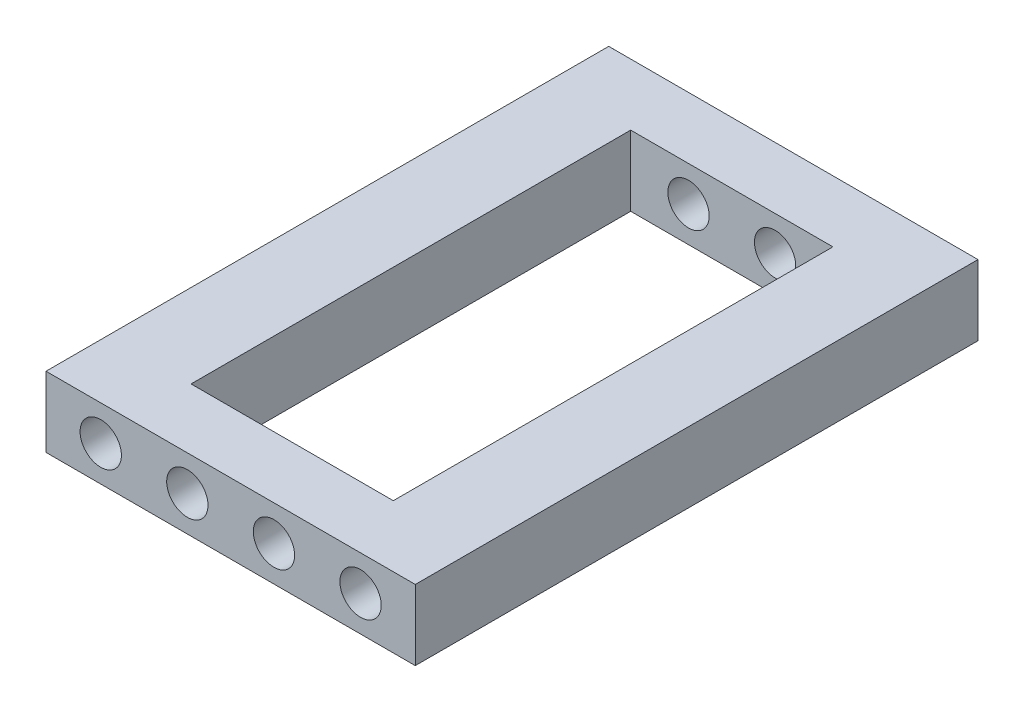
ISO-10303-21;
HEADER;
FILE_DESCRIPTION(('STEP AP214'),'2;1');
FILE_NAME('part.step','',(''),(''),'','','');
FILE_SCHEMA(('AUTOMOTIVE_DESIGN { 1 0 10303 214 1 1 1 1 }'));
ENDSEC;
DATA;
#1=APPLICATION_CONTEXT('core data for automotive mechanical design processes');
#2=APPLICATION_PROTOCOL_DEFINITION('international standard','automotive_design',2000,#1);
#3=PRODUCT_CONTEXT('',#1,'mechanical');
#4=PRODUCT('Part','Part','',(#3));
#5=PRODUCT_RELATED_PRODUCT_CATEGORY('part','',(#4));
#6=PRODUCT_DEFINITION_FORMATION('','',#4);
#7=PRODUCT_DEFINITION_CONTEXT('part definition',#1,'design');
#8=PRODUCT_DEFINITION('design','',#6,#7);
#9=PRODUCT_DEFINITION_SHAPE('','',#8);
#10=(LENGTH_UNIT() NAMED_UNIT(*) SI_UNIT(.MILLI.,.METRE.));
#11=(NAMED_UNIT(*) PLANE_ANGLE_UNIT() SI_UNIT($,.RADIAN.));
#12=(NAMED_UNIT(*) SI_UNIT($,.STERADIAN.) SOLID_ANGLE_UNIT());
#13=UNCERTAINTY_MEASURE_WITH_UNIT(LENGTH_MEASURE(1.E-05),#10,'distance_accuracy_value','');
#14=(GEOMETRIC_REPRESENTATION_CONTEXT(3) GLOBAL_UNCERTAINTY_ASSIGNED_CONTEXT((#13)) GLOBAL_UNIT_ASSIGNED_CONTEXT((#10,
#11,#12)) REPRESENTATION_CONTEXT('',''));
#15=CARTESIAN_POINT('',(0.,0.,0.));
#16=DIRECTION('',(0.,0.,1.));
#17=DIRECTION('',(1.,0.,0.));
#18=AXIS2_PLACEMENT_3D('',#15,#16,#17);
#19=CARTESIAN_POINT('',(-4.925,0.,32.));
#20=DIRECTION('',(0.,0.,-1.));
#21=DIRECTION('',(-1.,0.,0.));
#22=AXIS2_PLACEMENT_3D('',#19,#20,#21);
#23=CYLINDRICAL_SURFACE('',#22,2.35);
#24=CARTESIAN_POINT('',(-4.925,0.,25.));
#25=DIRECTION('',(0.,0.,1.));
#26=DIRECTION('',(1.,0.,0.));
#27=AXIS2_PLACEMENT_3D('',#24,#25,#26);
#28=CIRCLE('',#27,2.35);
#29=CARTESIAN_POINT('',(-2.575,0.,25.));
#30=VERTEX_POINT('',#29);
#31=EDGE_CURVE('E171',#30,#30,#28,.T.);
#32=ORIENTED_EDGE('',*,*,#31,.F.);
#33=EDGE_LOOP('',(#32));
#34=FACE_BOUND('',#33,.T.);
#35=CARTESIAN_POINT('',(-4.925,0.,32.));
#36=DIRECTION('',(0.,0.,1.));
#37=DIRECTION('',(1.,0.,0.));
#38=AXIS2_PLACEMENT_3D('',#35,#36,#37);
#39=CIRCLE('',#38,2.35);
#40=CARTESIAN_POINT('',(-2.575,0.,32.));
#41=VERTEX_POINT('',#40);
#42=EDGE_CURVE('E202',#41,#41,#39,.T.);
#43=ORIENTED_EDGE('',*,*,#42,.T.);
#44=EDGE_LOOP('',(#43));
#45=FACE_BOUND('',#44,.T.);
#46=ADVANCED_FACE('F44',(#34,#45),#23,.F.);
#47=CARTESIAN_POINT('',(-4.925,0.,-25.));
#48=DIRECTION('',(0.,0.,-1.));
#49=DIRECTION('',(-1.,0.,0.));
#50=AXIS2_PLACEMENT_3D('',#47,#48,#49);
#51=CIRCLE('',#50,2.35);
#52=CARTESIAN_POINT('',(-7.275,0.,-25.));
#53=VERTEX_POINT('',#52);
#54=EDGE_CURVE('E162',#53,#53,#51,.T.);
#55=ORIENTED_EDGE('',*,*,#54,.F.);
#56=EDGE_LOOP('',(#55));
#57=FACE_BOUND('',#56,.T.);
#58=CARTESIAN_POINT('',(-4.925,0.,-32.));
#59=DIRECTION('',(0.,0.,1.));
#60=DIRECTION('',(1.,0.,0.));
#61=AXIS2_PLACEMENT_3D('',#58,#59,#60);
#62=CIRCLE('',#61,2.35);
#63=CARTESIAN_POINT('',(-2.575,0.,-32.));
#64=VERTEX_POINT('',#63);
#65=EDGE_CURVE('E198',#64,#64,#62,.T.);
#66=ORIENTED_EDGE('',*,*,#65,.F.);
#67=EDGE_LOOP('',(#66));
#68=FACE_BOUND('',#67,.T.);
#69=ADVANCED_FACE('F269',(#57,#68),#23,.F.);
#70=CARTESIAN_POINT('',(4.925,0.,32.));
#71=DIRECTION('',(0.,0.,-1.));
#72=DIRECTION('',(-1.,0.,0.));
#73=AXIS2_PLACEMENT_3D('',#70,#71,#72);
#74=CYLINDRICAL_SURFACE('',#73,2.35);
#75=CARTESIAN_POINT('',(4.925,0.,25.));
#76=DIRECTION('',(0.,0.,1.));
#77=DIRECTION('',(1.,0.,0.));
#78=AXIS2_PLACEMENT_3D('',#75,#76,#77);
#79=CIRCLE('',#78,2.35);
#80=CARTESIAN_POINT('',(7.275,0.,25.));
#81=VERTEX_POINT('',#80);
#82=EDGE_CURVE('E170',#81,#81,#79,.T.);
#83=ORIENTED_EDGE('',*,*,#82,.F.);
#84=EDGE_LOOP('',(#83));
#85=FACE_BOUND('',#84,.T.);
#86=CARTESIAN_POINT('',(4.925,0.,32.));
#87=DIRECTION('',(0.,0.,1.));
#88=DIRECTION('',(-1.,0.,0.));
#89=AXIS2_PLACEMENT_3D('',#86,#87,#88);
#90=CIRCLE('',#89,2.35);
#91=CARTESIAN_POINT('',(2.575,0.,32.));
#92=VERTEX_POINT('',#91);
#93=EDGE_CURVE('E194',#92,#92,#90,.T.);
#94=ORIENTED_EDGE('',*,*,#93,.T.);
#95=EDGE_LOOP('',(#94));
#96=FACE_BOUND('',#95,.T.);
#97=ADVANCED_FACE('F276',(#85,#96),#74,.F.);
#98=CARTESIAN_POINT('',(4.925,0.,-25.));
#99=DIRECTION('',(0.,0.,-1.));
#100=DIRECTION('',(-1.,0.,0.));
#101=AXIS2_PLACEMENT_3D('',#98,#99,#100);
#102=CIRCLE('',#101,2.35);
#103=CARTESIAN_POINT('',(2.575,0.,-25.));
#104=VERTEX_POINT('',#103);
#105=EDGE_CURVE('E151',#104,#104,#102,.T.);
#106=ORIENTED_EDGE('',*,*,#105,.F.);
#107=EDGE_LOOP('',(#106));
#108=FACE_BOUND('',#107,.T.);
#109=CARTESIAN_POINT('',(4.925,0.,-32.));
#110=DIRECTION('',(0.,0.,1.));
#111=DIRECTION('',(-1.,0.,0.));
#112=AXIS2_PLACEMENT_3D('',#109,#110,#111);
#113=CIRCLE('',#112,2.35);
#114=CARTESIAN_POINT('',(2.575,0.,-32.));
#115=VERTEX_POINT('',#114);
#116=EDGE_CURVE('E190',#115,#115,#113,.T.);
#117=ORIENTED_EDGE('',*,*,#116,.F.);
#118=EDGE_LOOP('',(#117));
#119=FACE_BOUND('',#118,.T.);
#120=ADVANCED_FACE('F287',(#108,#119),#74,.F.);
#121=CARTESIAN_POINT('',(0.,0.,32.));
#122=DIRECTION('',(0.,0.,-1.));
#123=DIRECTION('',(-1.,0.,0.));
#124=AXIS2_PLACEMENT_3D('',#121,#122,#123);
#125=PLANE('',#124);
#126=DIRECTION('',(0.,1.,0.));
#127=VECTOR('',#126,1.);
#128=CARTESIAN_POINT('',(21.,-4.,32.));
#129=LINE('',#128,#127);
#130=CARTESIAN_POINT('',(21.,-4.,32.));
#131=VERTEX_POINT('',#130);
#132=CARTESIAN_POINT('',(21.,4.,32.));
#133=VERTEX_POINT('',#132);
#134=EDGE_CURVE('E210',#131,#133,#129,.T.);
#135=ORIENTED_EDGE('',*,*,#134,.T.);
#136=DIRECTION('',(-1.,0.,0.));
#137=VECTOR('',#136,1.);
#138=CARTESIAN_POINT('',(-21.,4.,32.));
#139=LINE('',#138,#137);
#140=CARTESIAN_POINT('',(-21.,4.,32.));
#141=VERTEX_POINT('',#140);
#142=EDGE_CURVE('E94',#133,#141,#139,.T.);
#143=ORIENTED_EDGE('',*,*,#142,.T.);
#144=DIRECTION('',(0.,-1.,0.));
#145=VECTOR('',#144,1.);
#146=CARTESIAN_POINT('',(-21.,-4.,32.));
#147=LINE('',#146,#145);
#148=CARTESIAN_POINT('',(-21.,-4.,32.));
#149=VERTEX_POINT('',#148);
#150=EDGE_CURVE('E215',#141,#149,#147,.T.);
#151=ORIENTED_EDGE('',*,*,#150,.T.);
#152=DIRECTION('',(1.,0.,0.));
#153=VECTOR('',#152,1.);
#154=CARTESIAN_POINT('',(-21.,-4.,32.));
#155=LINE('',#154,#153);
#156=EDGE_CURVE('E62',#149,#131,#155,.T.);
#157=ORIENTED_EDGE('',*,*,#156,.T.);
#158=EDGE_LOOP('',(#135,#143,#151,#157));
#159=FACE_BOUND('',#158,.T.);
#160=ORIENTED_EDGE('',*,*,#42,.F.);
#161=EDGE_LOOP('',(#160));
#162=FACE_BOUND('',#161,.T.);
#163=ORIENTED_EDGE('',*,*,#93,.F.);
#164=EDGE_LOOP('',(#163));
#165=FACE_BOUND('',#164,.T.);
#166=CARTESIAN_POINT('',(-14.775,0.,32.));
#167=DIRECTION('',(0.,0.,1.));
#168=DIRECTION('',(1.,0.,0.));
#169=AXIS2_PLACEMENT_3D('',#166,#167,#168);
#170=CIRCLE('',#169,2.35);
#171=CARTESIAN_POINT('',(-12.425,0.,32.));
#172=VERTEX_POINT('',#171);
#173=EDGE_CURVE('E186',#172,#172,#170,.T.);
#174=ORIENTED_EDGE('',*,*,#173,.F.);
#175=EDGE_LOOP('',(#174));
#176=FACE_BOUND('',#175,.T.);
#177=CARTESIAN_POINT('',(14.775,0.,32.));
#178=DIRECTION('',(0.,0.,1.));
#179=DIRECTION('',(-1.,0.,0.));
#180=AXIS2_PLACEMENT_3D('',#177,#178,#179);
#181=CIRCLE('',#180,2.35);
#182=CARTESIAN_POINT('',(12.425,0.,32.));
#183=VERTEX_POINT('',#182);
#184=EDGE_CURVE('E178',#183,#183,#181,.T.);
#185=ORIENTED_EDGE('',*,*,#184,.F.);
#186=EDGE_LOOP('',(#185));
#187=FACE_BOUND('',#186,.T.);
#188=ADVANCED_FACE('F283',(#159,#162,#165,#176,#187),#125,.F.);
#189=CARTESIAN_POINT('',(0.,0.,-32.));
#190=DIRECTION('',(0.,0.,-1.));
#191=DIRECTION('',(-1.,0.,0.));
#192=AXIS2_PLACEMENT_3D('',#189,#190,#191);
#193=PLANE('',#192);
#194=CARTESIAN_POINT('',(-14.775,0.,-32.));
#195=DIRECTION('',(0.,0.,1.));
#196=DIRECTION('',(1.,0.,0.));
#197=AXIS2_PLACEMENT_3D('',#194,#195,#196);
#198=CIRCLE('',#197,2.35);
#199=CARTESIAN_POINT('',(-12.425,0.,-32.));
#200=VERTEX_POINT('',#199);
#201=EDGE_CURVE('E182',#200,#200,#198,.T.);
#202=ORIENTED_EDGE('',*,*,#201,.T.);
#203=EDGE_LOOP('',(#202));
#204=FACE_BOUND('',#203,.T.);
#205=ORIENTED_EDGE('',*,*,#65,.T.);
#206=EDGE_LOOP('',(#205));
#207=FACE_BOUND('',#206,.T.);
#208=DIRECTION('',(0.,1.,0.));
#209=VECTOR('',#208,1.);
#210=CARTESIAN_POINT('',(21.,-4.,-32.));
#211=LINE('',#210,#209);
#212=CARTESIAN_POINT('',(21.,-4.,-32.));
#213=VERTEX_POINT('',#212);
#214=CARTESIAN_POINT('',(21.,4.,-32.));
#215=VERTEX_POINT('',#214);
#216=EDGE_CURVE('E206',#213,#215,#211,.T.);
#217=ORIENTED_EDGE('',*,*,#216,.F.);
#218=DIRECTION('',(1.,0.,0.));
#219=VECTOR('',#218,1.);
#220=CARTESIAN_POINT('',(-21.,-4.,-32.));
#221=LINE('',#220,#219);
#222=CARTESIAN_POINT('',(-21.,-4.,-32.));
#223=VERTEX_POINT('',#222);
#224=EDGE_CURVE('E86',#223,#213,#221,.T.);
#225=ORIENTED_EDGE('',*,*,#224,.F.);
#226=DIRECTION('',(0.,-1.,0.));
#227=VECTOR('',#226,1.);
#228=CARTESIAN_POINT('',(-21.,-4.,-32.));
#229=LINE('',#228,#227);
#230=CARTESIAN_POINT('',(-21.,4.,-32.));
#231=VERTEX_POINT('',#230);
#232=EDGE_CURVE('E80',#231,#223,#229,.T.);
#233=ORIENTED_EDGE('',*,*,#232,.F.);
#234=DIRECTION('',(-1.,0.,0.));
#235=VECTOR('',#234,1.);
#236=CARTESIAN_POINT('',(-21.,4.,-32.));
#237=LINE('',#236,#235);
#238=EDGE_CURVE('E224',#215,#231,#237,.T.);
#239=ORIENTED_EDGE('',*,*,#238,.F.);
#240=EDGE_LOOP('',(#217,#225,#233,#239));
#241=FACE_BOUND('',#240,.T.);
#242=ORIENTED_EDGE('',*,*,#116,.T.);
#243=EDGE_LOOP('',(#242));
#244=FACE_BOUND('',#243,.T.);
#245=CARTESIAN_POINT('',(14.775,0.,-32.));
#246=DIRECTION('',(0.,0.,1.));
#247=DIRECTION('',(-1.,0.,0.));
#248=AXIS2_PLACEMENT_3D('',#245,#246,#247);
#249=CIRCLE('',#248,2.35);
#250=CARTESIAN_POINT('',(12.425,0.,-32.));
#251=VERTEX_POINT('',#250);
#252=EDGE_CURVE('E177',#251,#251,#249,.T.);
#253=ORIENTED_EDGE('',*,*,#252,.T.);
#254=EDGE_LOOP('',(#253));
#255=FACE_BOUND('',#254,.T.);
#256=ADVANCED_FACE('F286',(#204,#207,#241,#244,#255),#193,.T.);
#257=CARTESIAN_POINT('',(21.,-4.,32.));
#258=DIRECTION('',(-1.,0.,0.));
#259=DIRECTION('',(0.,0.,1.));
#260=AXIS2_PLACEMENT_3D('',#257,#258,#259);
#261=PLANE('',#260);
#262=ORIENTED_EDGE('',*,*,#216,.T.);
#263=DIRECTION('',(0.,0.,-1.));
#264=VECTOR('',#263,1.);
#265=CARTESIAN_POINT('',(21.,4.,32.));
#266=LINE('',#265,#264);
#267=EDGE_CURVE('E239',#133,#215,#266,.T.);
#268=ORIENTED_EDGE('',*,*,#267,.F.);
#269=ORIENTED_EDGE('',*,*,#134,.F.);
#270=DIRECTION('',(0.,0.,-1.));
#271=VECTOR('',#270,1.);
#272=CARTESIAN_POINT('',(21.,-4.,32.));
#273=LINE('',#272,#271);
#274=EDGE_CURVE('E220',#131,#213,#273,.T.);
#275=ORIENTED_EDGE('',*,*,#274,.T.);
#276=EDGE_LOOP('',(#262,#268,#269,#275));
#277=FACE_BOUND('',#276,.T.);
#278=ADVANCED_FACE('F46',(#277),#261,.F.);
#279=CARTESIAN_POINT('',(-21.,4.,32.));
#280=DIRECTION('',(0.,-1.,0.));
#281=DIRECTION('',(0.,0.,-1.));
#282=AXIS2_PLACEMENT_3D('',#279,#280,#281);
#283=PLANE('',#282);
#284=DIRECTION('',(-1.,0.,0.));
#285=VECTOR('',#284,1.);
#286=CARTESIAN_POINT('',(-11.5,4.,-25.));
#287=LINE('',#286,#285);
#288=CARTESIAN_POINT('',(11.5,4.,-25.));
#289=VERTEX_POINT('',#288);
#290=CARTESIAN_POINT('',(-11.5,4.,-25.));
#291=VERTEX_POINT('',#290);
#292=EDGE_CURVE('E157',#289,#291,#287,.T.);
#293=ORIENTED_EDGE('',*,*,#292,.F.);
#294=DIRECTION('',(0.,0.,-1.));
#295=VECTOR('',#294,1.);
#296=CARTESIAN_POINT('',(11.5,4.,25.));
#297=LINE('',#296,#295);
#298=CARTESIAN_POINT('',(11.5,4.,25.));
#299=VERTEX_POINT('',#298);
#300=EDGE_CURVE('E132',#299,#289,#297,.T.);
#301=ORIENTED_EDGE('',*,*,#300,.F.);
#302=DIRECTION('',(1.,0.,0.));
#303=VECTOR('',#302,1.);
#304=CARTESIAN_POINT('',(-11.5,4.,25.));
#305=LINE('',#304,#303);
#306=CARTESIAN_POINT('',(-11.5,4.,25.));
#307=VERTEX_POINT('',#306);
#308=EDGE_CURVE('E131',#307,#299,#305,.T.);
#309=ORIENTED_EDGE('',*,*,#308,.F.);
#310=DIRECTION('',(0.,0.,1.));
#311=VECTOR('',#310,1.);
#312=CARTESIAN_POINT('',(-11.5,4.,25.));
#313=LINE('',#312,#311);
#314=EDGE_CURVE('E120',#291,#307,#313,.T.);
#315=ORIENTED_EDGE('',*,*,#314,.F.);
#316=EDGE_LOOP('',(#293,#301,#309,#315));
#317=FACE_BOUND('',#316,.T.);
#318=ORIENTED_EDGE('',*,*,#238,.T.);
#319=DIRECTION('',(0.,0.,-1.));
#320=VECTOR('',#319,1.);
#321=CARTESIAN_POINT('',(-21.,4.,32.));
#322=LINE('',#321,#320);
#323=EDGE_CURVE('E236',#141,#231,#322,.T.);
#324=ORIENTED_EDGE('',*,*,#323,.F.);
#325=ORIENTED_EDGE('',*,*,#142,.F.);
#326=ORIENTED_EDGE('',*,*,#267,.T.);
#327=EDGE_LOOP('',(#318,#324,#325,#326));
#328=FACE_BOUND('',#327,.T.);
#329=ADVANCED_FACE('F145',(#317,#328),#283,.F.);
#330=CARTESIAN_POINT('',(-21.,-4.,32.));
#331=DIRECTION('',(1.,0.,0.));
#332=DIRECTION('',(0.,0.,-1.));
#333=AXIS2_PLACEMENT_3D('',#330,#331,#332);
#334=PLANE('',#333);
#335=ORIENTED_EDGE('',*,*,#232,.T.);
#336=DIRECTION('',(0.,0.,-1.));
#337=VECTOR('',#336,1.);
#338=CARTESIAN_POINT('',(-21.,-4.,32.));
#339=LINE('',#338,#337);
#340=EDGE_CURVE('E233',#149,#223,#339,.T.);
#341=ORIENTED_EDGE('',*,*,#340,.F.);
#342=ORIENTED_EDGE('',*,*,#150,.F.);
#343=ORIENTED_EDGE('',*,*,#323,.T.);
#344=EDGE_LOOP('',(#335,#341,#342,#343));
#345=FACE_BOUND('',#344,.T.);
#346=ADVANCED_FACE('F293',(#345),#334,.F.);
#347=CARTESIAN_POINT('',(-21.,-4.,32.));
#348=DIRECTION('',(0.,1.,0.));
#349=DIRECTION('',(0.,0.,1.));
#350=AXIS2_PLACEMENT_3D('',#347,#348,#349);
#351=PLANE('',#350);
#352=DIRECTION('',(1.,0.,0.));
#353=VECTOR('',#352,1.);
#354=CARTESIAN_POINT('',(-21.,-4.,25.));
#355=LINE('',#354,#353);
#356=CARTESIAN_POINT('',(-11.5,-4.,25.));
#357=VERTEX_POINT('',#356);
#358=CARTESIAN_POINT('',(11.5,-4.,25.));
#359=VERTEX_POINT('',#358);
#360=EDGE_CURVE('E141',#357,#359,#355,.T.);
#361=ORIENTED_EDGE('',*,*,#360,.T.);
#362=DIRECTION('',(0.,0.,-1.));
#363=VECTOR('',#362,1.);
#364=CARTESIAN_POINT('',(11.5,-4.,32.));
#365=LINE('',#364,#363);
#366=CARTESIAN_POINT('',(11.5,-4.,-25.));
#367=VERTEX_POINT('',#366);
#368=EDGE_CURVE('E54',#359,#367,#365,.T.);
#369=ORIENTED_EDGE('',*,*,#368,.T.);
#370=DIRECTION('',(-1.,0.,0.));
#371=VECTOR('',#370,1.);
#372=CARTESIAN_POINT('',(-21.,-4.,-25.));
#373=LINE('',#372,#371);
#374=CARTESIAN_POINT('',(-11.5,-4.,-25.));
#375=VERTEX_POINT('',#374);
#376=EDGE_CURVE('E166',#367,#375,#373,.T.);
#377=ORIENTED_EDGE('',*,*,#376,.T.);
#378=DIRECTION('',(0.,0.,1.));
#379=VECTOR('',#378,1.);
#380=CARTESIAN_POINT('',(-11.5,-4.,32.));
#381=LINE('',#380,#379);
#382=EDGE_CURVE('E11',#375,#357,#381,.T.);
#383=ORIENTED_EDGE('',*,*,#382,.T.);
#384=EDGE_LOOP('',(#361,#369,#377,#383));
#385=FACE_BOUND('',#384,.T.);
#386=ORIENTED_EDGE('',*,*,#224,.T.);
#387=ORIENTED_EDGE('',*,*,#274,.F.);
#388=ORIENTED_EDGE('',*,*,#156,.F.);
#389=ORIENTED_EDGE('',*,*,#340,.T.);
#390=EDGE_LOOP('',(#386,#387,#388,#389));
#391=FACE_BOUND('',#390,.T.);
#392=ADVANCED_FACE('F250',(#385,#391),#351,.F.);
#393=CARTESIAN_POINT('',(-14.775,0.,32.));
#394=DIRECTION('',(0.,0.,-1.));
#395=DIRECTION('',(-1.,0.,0.));
#396=AXIS2_PLACEMENT_3D('',#393,#394,#395);
#397=CYLINDRICAL_SURFACE('',#396,2.35);
#398=ORIENTED_EDGE('',*,*,#173,.T.);
#399=EDGE_LOOP('',(#398));
#400=FACE_BOUND('',#399,.T.);
#401=ORIENTED_EDGE('',*,*,#201,.F.);
#402=EDGE_LOOP('',(#401));
#403=FACE_BOUND('',#402,.T.);
#404=ADVANCED_FACE('F292',(#400,#403),#397,.F.);
#405=CARTESIAN_POINT('',(14.775,0.,32.));
#406=DIRECTION('',(0.,0.,-1.));
#407=DIRECTION('',(-1.,0.,0.));
#408=AXIS2_PLACEMENT_3D('',#405,#406,#407);
#409=CYLINDRICAL_SURFACE('',#408,2.35);
#410=ORIENTED_EDGE('',*,*,#184,.T.);
#411=EDGE_LOOP('',(#410));
#412=FACE_BOUND('',#411,.T.);
#413=ORIENTED_EDGE('',*,*,#252,.F.);
#414=EDGE_LOOP('',(#413));
#415=FACE_BOUND('',#414,.T.);
#416=ADVANCED_FACE('F265',(#412,#415),#409,.F.);
#417=CARTESIAN_POINT('',(-11.5,-10.,-25.));
#418=DIRECTION('',(0.,0.,-1.));
#419=DIRECTION('',(-1.,0.,0.));
#420=AXIS2_PLACEMENT_3D('',#417,#418,#419);
#421=PLANE('',#420);
#422=ORIENTED_EDGE('',*,*,#54,.T.);
#423=EDGE_LOOP('',(#422));
#424=FACE_BOUND('',#423,.T.);
#425=ORIENTED_EDGE('',*,*,#105,.T.);
#426=EDGE_LOOP('',(#425));
#427=FACE_BOUND('',#426,.T.);
#428=DIRECTION('',(0.,1.,0.));
#429=VECTOR('',#428,1.);
#430=CARTESIAN_POINT('',(11.5,-10.,-25.));
#431=LINE('',#430,#429);
#432=EDGE_CURVE('E153',#367,#289,#431,.T.);
#433=ORIENTED_EDGE('',*,*,#432,.T.);
#434=ORIENTED_EDGE('',*,*,#292,.T.);
#435=DIRECTION('',(0.,1.,0.));
#436=VECTOR('',#435,1.);
#437=CARTESIAN_POINT('',(-11.5,-10.,-25.));
#438=LINE('',#437,#436);
#439=EDGE_CURVE('E125',#375,#291,#438,.T.);
#440=ORIENTED_EDGE('',*,*,#439,.F.);
#441=ORIENTED_EDGE('',*,*,#376,.F.);
#442=EDGE_LOOP('',(#433,#434,#440,#441));
#443=FACE_BOUND('',#442,.T.);
#444=ADVANCED_FACE('F254',(#424,#427,#443),#421,.F.);
#445=CARTESIAN_POINT('',(11.5,-10.,25.));
#446=DIRECTION('',(1.,0.,0.));
#447=DIRECTION('',(0.,0.,-1.));
#448=AXIS2_PLACEMENT_3D('',#445,#446,#447);
#449=PLANE('',#448);
#450=ORIENTED_EDGE('',*,*,#300,.T.);
#451=ORIENTED_EDGE('',*,*,#432,.F.);
#452=ORIENTED_EDGE('',*,*,#368,.F.);
#453=DIRECTION('',(0.,1.,0.));
#454=VECTOR('',#453,1.);
#455=CARTESIAN_POINT('',(11.5,-10.,25.));
#456=LINE('',#455,#454);
#457=EDGE_CURVE('E143',#359,#299,#456,.T.);
#458=ORIENTED_EDGE('',*,*,#457,.T.);
#459=EDGE_LOOP('',(#450,#451,#452,#458));
#460=FACE_BOUND('',#459,.T.);
#461=ADVANCED_FACE('F255',(#460),#449,.F.);
#462=CARTESIAN_POINT('',(-11.5,-10.,25.));
#463=DIRECTION('',(-1.,0.,0.));
#464=DIRECTION('',(0.,0.,1.));
#465=AXIS2_PLACEMENT_3D('',#462,#463,#464);
#466=PLANE('',#465);
#467=DIRECTION('',(0.,1.,0.));
#468=VECTOR('',#467,1.);
#469=CARTESIAN_POINT('',(-11.5,-10.,25.));
#470=LINE('',#469,#468);
#471=EDGE_CURVE('E123',#357,#307,#470,.T.);
#472=ORIENTED_EDGE('',*,*,#471,.F.);
#473=ORIENTED_EDGE('',*,*,#382,.F.);
#474=ORIENTED_EDGE('',*,*,#439,.T.);
#475=ORIENTED_EDGE('',*,*,#314,.T.);
#476=EDGE_LOOP('',(#472,#473,#474,#475));
#477=FACE_BOUND('',#476,.T.);
#478=ADVANCED_FACE('F122',(#477),#466,.F.);
#479=CARTESIAN_POINT('',(-11.5,-10.,25.));
#480=DIRECTION('',(0.,0.,1.));
#481=DIRECTION('',(1.,0.,0.));
#482=AXIS2_PLACEMENT_3D('',#479,#480,#481);
#483=PLANE('',#482);
#484=ORIENTED_EDGE('',*,*,#31,.T.);
#485=EDGE_LOOP('',(#484));
#486=FACE_BOUND('',#485,.T.);
#487=ORIENTED_EDGE('',*,*,#82,.T.);
#488=EDGE_LOOP('',(#487));
#489=FACE_BOUND('',#488,.T.);
#490=ORIENTED_EDGE('',*,*,#471,.T.);
#491=ORIENTED_EDGE('',*,*,#308,.T.);
#492=ORIENTED_EDGE('',*,*,#457,.F.);
#493=ORIENTED_EDGE('',*,*,#360,.F.);
#494=EDGE_LOOP('',(#490,#491,#492,#493));
#495=FACE_BOUND('',#494,.T.);
#496=ADVANCED_FACE('F137',(#486,#489,#495),#483,.F.);
#497=CLOSED_SHELL('',(#46,#69,#97,#120,#188,#256,#278,#329,#346,#392,#404,#416,#444,#461,#478,#496));
#498=MANIFOLD_SOLID_BREP('B2',#497);
#499=ADVANCED_BREP_SHAPE_REPRESENTATION('',(#18,#498),#14);
#500=SHAPE_DEFINITION_REPRESENTATION(#9,#499);
ENDSEC;
END-ISO-10303-21;
